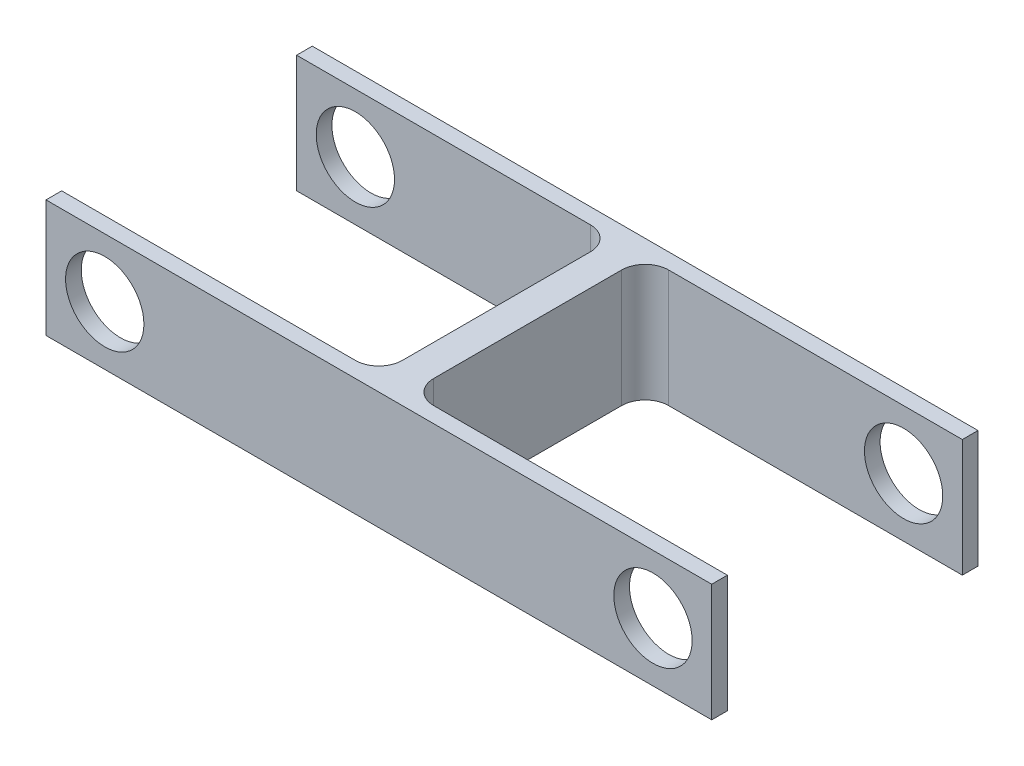
ISO-10303-21;
HEADER;
FILE_DESCRIPTION(('STEP AP214'),'2;1');
FILE_NAME('part.step','',(''),(''),'','','');
FILE_SCHEMA(('AUTOMOTIVE_DESIGN { 1 0 10303 214 1 1 1 1 }'));
ENDSEC;
DATA;
#1=APPLICATION_CONTEXT('core data for automotive mechanical design processes');
#2=APPLICATION_PROTOCOL_DEFINITION('international standard','automotive_design',2000,#1);
#3=PRODUCT_CONTEXT('',#1,'mechanical');
#4=PRODUCT('Part','Part','',(#3));
#5=PRODUCT_RELATED_PRODUCT_CATEGORY('part','',(#4));
#6=PRODUCT_DEFINITION_FORMATION('','',#4);
#7=PRODUCT_DEFINITION_CONTEXT('part definition',#1,'design');
#8=PRODUCT_DEFINITION('design','',#6,#7);
#9=PRODUCT_DEFINITION_SHAPE('','',#8);
#10=(LENGTH_UNIT() NAMED_UNIT(*) SI_UNIT(.MILLI.,.METRE.));
#11=(NAMED_UNIT(*) PLANE_ANGLE_UNIT() SI_UNIT($,.RADIAN.));
#12=(NAMED_UNIT(*) SI_UNIT($,.STERADIAN.) SOLID_ANGLE_UNIT());
#13=UNCERTAINTY_MEASURE_WITH_UNIT(LENGTH_MEASURE(1.E-05),#10,'distance_accuracy_value','');
#14=(GEOMETRIC_REPRESENTATION_CONTEXT(3) GLOBAL_UNCERTAINTY_ASSIGNED_CONTEXT((#13)) GLOBAL_UNIT_ASSIGNED_CONTEXT((#10,
#11,#12)) REPRESENTATION_CONTEXT('',''));
#15=CARTESIAN_POINT('',(0.,0.,0.));
#16=DIRECTION('',(0.,0.,1.));
#17=DIRECTION('',(1.,0.,0.));
#18=AXIS2_PLACEMENT_3D('',#15,#16,#17);
#19=CARTESIAN_POINT('',(0.,0.,0.));
#20=DIRECTION('',(0.,0.,-1.));
#21=DIRECTION('',(-1.,0.,0.));
#22=AXIS2_PLACEMENT_3D('',#19,#20,#21);
#23=PLANE('',#22);
#24=CARTESIAN_POINT('',(88.9,0.,0.));
#25=DIRECTION('',(0.,0.,1.));
#26=DIRECTION('',(1.,0.,0.));
#27=AXIS2_PLACEMENT_3D('',#24,#25,#26);
#28=CIRCLE('',#27,12.7);
#29=CARTESIAN_POINT('',(101.6,0.,0.));
#30=VERTEX_POINT('',#29);
#31=EDGE_CURVE('E217',#30,#30,#28,.T.);
#32=ORIENTED_EDGE('',*,*,#31,.T.);
#33=EDGE_LOOP('',(#32));
#34=FACE_BOUND('',#33,.T.);
#35=DIRECTION('',(1.,0.,0.));
#36=VECTOR('',#35,1.);
#37=CARTESIAN_POINT('',(-107.95,-19.05,0.));
#38=LINE('',#37,#36);
#39=CARTESIAN_POINT('',(12.7,-19.05,0.));
#40=VERTEX_POINT('',#39);
#41=CARTESIAN_POINT('',(107.95,-19.05,0.));
#42=VERTEX_POINT('',#41);
#43=EDGE_CURVE('E271',#40,#42,#38,.T.);
#44=ORIENTED_EDGE('',*,*,#43,.F.);
#45=DIRECTION('',(0.,1.,0.));
#46=VECTOR('',#45,1.);
#47=CARTESIAN_POINT('',(12.7,19.05,0.));
#48=LINE('',#47,#46);
#49=CARTESIAN_POINT('',(12.7,19.05,0.));
#50=VERTEX_POINT('',#49);
#51=EDGE_CURVE('E313',#40,#50,#48,.T.);
#52=ORIENTED_EDGE('',*,*,#51,.T.);
#53=DIRECTION('',(-1.,0.,0.));
#54=VECTOR('',#53,1.);
#55=CARTESIAN_POINT('',(-107.95,19.05,0.));
#56=LINE('',#55,#54);
#57=CARTESIAN_POINT('',(107.95,19.05,0.));
#58=VERTEX_POINT('',#57);
#59=EDGE_CURVE('E264',#58,#50,#56,.T.);
#60=ORIENTED_EDGE('',*,*,#59,.F.);
#61=DIRECTION('',(0.,1.,0.));
#62=VECTOR('',#61,1.);
#63=CARTESIAN_POINT('',(107.95,-19.05,0.));
#64=LINE('',#63,#62);
#65=EDGE_CURVE('E233',#42,#58,#64,.T.);
#66=ORIENTED_EDGE('',*,*,#65,.F.);
#67=EDGE_LOOP('',(#44,#52,#60,#66));
#68=FACE_BOUND('',#67,.T.);
#69=ADVANCED_FACE('F39',(#34,#68),#23,.T.);
#70=CARTESIAN_POINT('',(-88.9,0.,0.));
#71=DIRECTION('',(0.,0.,1.));
#72=DIRECTION('',(1.,0.,0.));
#73=AXIS2_PLACEMENT_3D('',#70,#71,#72);
#74=CIRCLE('',#73,12.7);
#75=CARTESIAN_POINT('',(-76.2,0.,0.));
#76=VERTEX_POINT('',#75);
#77=EDGE_CURVE('E234',#76,#76,#74,.T.);
#78=ORIENTED_EDGE('',*,*,#77,.T.);
#79=EDGE_LOOP('',(#78));
#80=FACE_BOUND('',#79,.T.);
#81=CARTESIAN_POINT('',(-12.7,19.05,0.));
#82=VERTEX_POINT('',#81);
#83=CARTESIAN_POINT('',(-107.95,19.05,0.));
#84=VERTEX_POINT('',#83);
#85=EDGE_CURVE('E263',#82,#84,#56,.T.);
#86=ORIENTED_EDGE('',*,*,#85,.F.);
#87=DIRECTION('',(0.,-1.,0.));
#88=VECTOR('',#87,1.);
#89=CARTESIAN_POINT('',(-12.7,-19.05,0.));
#90=LINE('',#89,#88);
#91=CARTESIAN_POINT('',(-12.7,-19.05,0.));
#92=VERTEX_POINT('',#91);
#93=EDGE_CURVE('E309',#82,#92,#90,.T.);
#94=ORIENTED_EDGE('',*,*,#93,.T.);
#95=CARTESIAN_POINT('',(-107.95,-19.05,0.));
#96=VERTEX_POINT('',#95);
#97=EDGE_CURVE('E250',#96,#92,#38,.T.);
#98=ORIENTED_EDGE('',*,*,#97,.F.);
#99=DIRECTION('',(0.,-1.,0.));
#100=VECTOR('',#99,1.);
#101=CARTESIAN_POINT('',(-107.95,-19.05,0.));
#102=LINE('',#101,#100);
#103=EDGE_CURVE('E268',#84,#96,#102,.T.);
#104=ORIENTED_EDGE('',*,*,#103,.F.);
#105=EDGE_LOOP('',(#86,#94,#98,#104));
#106=FACE_BOUND('',#105,.T.);
#107=ADVANCED_FACE('F357',(#80,#106),#23,.T.);
#108=CARTESIAN_POINT('',(107.95,-19.05,5.08));
#109=DIRECTION('',(-1.,0.,0.));
#110=DIRECTION('',(0.,0.,1.));
#111=AXIS2_PLACEMENT_3D('',#108,#109,#110);
#112=PLANE('',#111);
#113=ORIENTED_EDGE('',*,*,#65,.T.);
#114=DIRECTION('',(0.,0.,-1.));
#115=VECTOR('',#114,1.);
#116=CARTESIAN_POINT('',(107.95,19.05,5.08));
#117=LINE('',#116,#115);
#118=CARTESIAN_POINT('',(107.95,19.05,5.08));
#119=VERTEX_POINT('',#118);
#120=EDGE_CURVE('E285',#119,#58,#117,.T.);
#121=ORIENTED_EDGE('',*,*,#120,.F.);
#122=DIRECTION('',(0.,1.,0.));
#123=VECTOR('',#122,1.);
#124=CARTESIAN_POINT('',(107.95,-19.05,5.08));
#125=LINE('',#124,#123);
#126=CARTESIAN_POINT('',(107.95,-19.05,5.08));
#127=VERTEX_POINT('',#126);
#128=EDGE_CURVE('E245',#127,#119,#125,.T.);
#129=ORIENTED_EDGE('',*,*,#128,.F.);
#130=DIRECTION('',(0.,0.,-1.));
#131=VECTOR('',#130,1.);
#132=CARTESIAN_POINT('',(107.95,-19.05,5.08));
#133=LINE('',#132,#131);
#134=EDGE_CURVE('E259',#127,#42,#133,.T.);
#135=ORIENTED_EDGE('',*,*,#134,.T.);
#136=EDGE_LOOP('',(#113,#121,#129,#135));
#137=FACE_BOUND('',#136,.T.);
#138=ADVANCED_FACE('F365',(#137),#112,.F.);
#139=CARTESIAN_POINT('',(-107.95,19.05,5.08));
#140=DIRECTION('',(0.,-1.,0.));
#141=DIRECTION('',(0.,0.,-1.));
#142=AXIS2_PLACEMENT_3D('',#139,#140,#141);
#143=PLANE('',#142);
#144=ORIENTED_EDGE('',*,*,#59,.T.);
#145=CARTESIAN_POINT('',(12.7,19.05,-7.62));
#146=DIRECTION('',(0.,-1.,0.));
#147=DIRECTION('',(0.,0.,-1.));
#148=AXIS2_PLACEMENT_3D('',#145,#146,#147);
#149=CIRCLE('',#148,7.62);
#150=CARTESIAN_POINT('',(5.08,19.05,-7.62000000000001));
#151=VERTEX_POINT('',#150);
#152=EDGE_CURVE('E48',#50,#151,#149,.T.);
#153=ORIENTED_EDGE('',*,*,#152,.T.);
#154=DIRECTION('',(0.,0.,1.));
#155=VECTOR('',#154,1.);
#156=CARTESIAN_POINT('',(5.08,19.05,-38.1));
#157=LINE('',#156,#155);
#158=CARTESIAN_POINT('',(5.08,19.05,-68.58));
#159=VERTEX_POINT('',#158);
#160=EDGE_CURVE('E163',#159,#151,#157,.T.);
#161=ORIENTED_EDGE('',*,*,#160,.F.);
#162=CARTESIAN_POINT('',(12.7,19.05,-68.58));
#163=DIRECTION('',(0.,-1.,0.));
#164=DIRECTION('',(0.,0.,-1.));
#165=AXIS2_PLACEMENT_3D('',#162,#163,#164);
#166=CIRCLE('',#165,7.62);
#167=CARTESIAN_POINT('',(12.7,19.05,-76.2));
#168=VERTEX_POINT('',#167);
#169=EDGE_CURVE('E316',#159,#168,#166,.T.);
#170=ORIENTED_EDGE('',*,*,#169,.T.);
#171=DIRECTION('',(-1.,0.,0.));
#172=VECTOR('',#171,1.);
#173=CARTESIAN_POINT('',(-107.95,19.05,-76.2));
#174=LINE('',#173,#172);
#175=CARTESIAN_POINT('',(107.95,19.05,-76.2));
#176=VERTEX_POINT('',#175);
#177=EDGE_CURVE('E175',#176,#168,#174,.T.);
#178=ORIENTED_EDGE('',*,*,#177,.F.);
#179=DIRECTION('',(0.,0.,1.));
#180=VECTOR('',#179,1.);
#181=CARTESIAN_POINT('',(107.95,19.05,-81.28));
#182=LINE('',#181,#180);
#183=CARTESIAN_POINT('',(107.95,19.05,-81.28));
#184=VERTEX_POINT('',#183);
#185=EDGE_CURVE('E189',#184,#176,#182,.T.);
#186=ORIENTED_EDGE('',*,*,#185,.F.);
#187=DIRECTION('',(-1.,0.,0.));
#188=VECTOR('',#187,1.);
#189=CARTESIAN_POINT('',(-107.95,19.05,-81.28));
#190=LINE('',#189,#188);
#191=CARTESIAN_POINT('',(-107.95,19.05,-81.28));
#192=VERTEX_POINT('',#191);
#193=EDGE_CURVE('E173',#184,#192,#190,.T.);
#194=ORIENTED_EDGE('',*,*,#193,.T.);
#195=DIRECTION('',(0.,0.,1.));
#196=VECTOR('',#195,1.);
#197=CARTESIAN_POINT('',(-107.95,19.05,-81.28));
#198=LINE('',#197,#196);
#199=CARTESIAN_POINT('',(-107.95,19.05,-76.2));
#200=VERTEX_POINT('',#199);
#201=EDGE_CURVE('E208',#192,#200,#198,.T.);
#202=ORIENTED_EDGE('',*,*,#201,.T.);
#203=CARTESIAN_POINT('',(-12.7,19.05,-76.2));
#204=VERTEX_POINT('',#203);
#205=EDGE_CURVE('E202',#204,#200,#174,.T.);
#206=ORIENTED_EDGE('',*,*,#205,.F.);
#207=CARTESIAN_POINT('',(-12.7,19.05,-68.58));
#208=DIRECTION('',(0.,-1.,0.));
#209=DIRECTION('',(0.,0.,-1.));
#210=AXIS2_PLACEMENT_3D('',#207,#208,#209);
#211=CIRCLE('',#210,7.62);
#212=CARTESIAN_POINT('',(-5.08,19.05,-68.58));
#213=VERTEX_POINT('',#212);
#214=EDGE_CURVE('E325',#204,#213,#211,.T.);
#215=ORIENTED_EDGE('',*,*,#214,.T.);
#216=DIRECTION('',(0.,0.,1.));
#217=VECTOR('',#216,1.);
#218=CARTESIAN_POINT('',(-5.08,19.05,-38.1));
#219=LINE('',#218,#217);
#220=CARTESIAN_POINT('',(-5.08,19.05,-7.62000000000001));
#221=VERTEX_POINT('',#220);
#222=EDGE_CURVE('E222',#213,#221,#219,.T.);
#223=ORIENTED_EDGE('',*,*,#222,.T.);
#224=CARTESIAN_POINT('',(-12.7,19.05,-7.62));
#225=DIRECTION('',(0.,-1.,0.));
#226=DIRECTION('',(0.,0.,-1.));
#227=AXIS2_PLACEMENT_3D('',#224,#225,#226);
#228=CIRCLE('',#227,7.62);
#229=EDGE_CURVE('E331',#221,#82,#228,.T.);
#230=ORIENTED_EDGE('',*,*,#229,.T.);
#231=ORIENTED_EDGE('',*,*,#85,.T.);
#232=DIRECTION('',(0.,0.,-1.));
#233=VECTOR('',#232,1.);
#234=CARTESIAN_POINT('',(-107.95,19.05,5.08));
#235=LINE('',#234,#233);
#236=CARTESIAN_POINT('',(-107.95,19.05,5.08));
#237=VERTEX_POINT('',#236);
#238=EDGE_CURVE('E281',#237,#84,#235,.T.);
#239=ORIENTED_EDGE('',*,*,#238,.F.);
#240=DIRECTION('',(-1.,0.,0.));
#241=VECTOR('',#240,1.);
#242=CARTESIAN_POINT('',(-107.95,19.05,5.08));
#243=LINE('',#242,#241);
#244=EDGE_CURVE('E249',#119,#237,#243,.T.);
#245=ORIENTED_EDGE('',*,*,#244,.F.);
#246=ORIENTED_EDGE('',*,*,#120,.T.);
#247=EDGE_LOOP('',(#144,#153,#161,#170,#178,#186,#194,#202,#206,#215,#223,#230,#231,#239,#245,#246));
#248=FACE_BOUND('',#247,.T.);
#249=ADVANCED_FACE('F336',(#248),#143,.F.);
#250=CARTESIAN_POINT('',(-107.95,-19.05,5.08));
#251=DIRECTION('',(1.,0.,0.));
#252=DIRECTION('',(0.,0.,-1.));
#253=AXIS2_PLACEMENT_3D('',#250,#251,#252);
#254=PLANE('',#253);
#255=ORIENTED_EDGE('',*,*,#103,.T.);
#256=DIRECTION('',(0.,0.,-1.));
#257=VECTOR('',#256,1.);
#258=CARTESIAN_POINT('',(-107.95,-19.05,5.08));
#259=LINE('',#258,#257);
#260=CARTESIAN_POINT('',(-107.95,-19.05,5.08));
#261=VERTEX_POINT('',#260);
#262=EDGE_CURVE('E277',#261,#96,#259,.T.);
#263=ORIENTED_EDGE('',*,*,#262,.F.);
#264=DIRECTION('',(0.,-1.,0.));
#265=VECTOR('',#264,1.);
#266=CARTESIAN_POINT('',(-107.95,-19.05,5.08));
#267=LINE('',#266,#265);
#268=EDGE_CURVE('E253',#237,#261,#267,.T.);
#269=ORIENTED_EDGE('',*,*,#268,.F.);
#270=ORIENTED_EDGE('',*,*,#238,.T.);
#271=EDGE_LOOP('',(#255,#263,#269,#270));
#272=FACE_BOUND('',#271,.T.);
#273=ADVANCED_FACE('F354',(#272),#254,.F.);
#274=CARTESIAN_POINT('',(-107.95,-19.05,5.08));
#275=DIRECTION('',(0.,1.,0.));
#276=DIRECTION('',(0.,0.,1.));
#277=AXIS2_PLACEMENT_3D('',#274,#275,#276);
#278=PLANE('',#277);
#279=ORIENTED_EDGE('',*,*,#97,.T.);
#280=CARTESIAN_POINT('',(-12.7,-19.05,-7.62));
#281=DIRECTION('',(0.,1.,0.));
#282=DIRECTION('',(0.,0.,1.));
#283=AXIS2_PLACEMENT_3D('',#280,#281,#282);
#284=CIRCLE('',#283,7.62);
#285=CARTESIAN_POINT('',(-5.08,-19.05,-7.62000000000001));
#286=VERTEX_POINT('',#285);
#287=EDGE_CURVE('E328',#92,#286,#284,.T.);
#288=ORIENTED_EDGE('',*,*,#287,.T.);
#289=DIRECTION('',(0.,0.,1.));
#290=VECTOR('',#289,1.);
#291=CARTESIAN_POINT('',(-5.08,-19.05,-38.1));
#292=LINE('',#291,#290);
#293=CARTESIAN_POINT('',(-5.08,-19.05,-68.58));
#294=VERTEX_POINT('',#293);
#295=EDGE_CURVE('E218',#294,#286,#292,.T.);
#296=ORIENTED_EDGE('',*,*,#295,.F.);
#297=CARTESIAN_POINT('',(-12.7,-19.05,-68.58));
#298=DIRECTION('',(0.,1.,0.));
#299=DIRECTION('',(0.,0.,1.));
#300=AXIS2_PLACEMENT_3D('',#297,#298,#299);
#301=CIRCLE('',#300,7.62);
#302=CARTESIAN_POINT('',(-12.7,-19.05,-76.2));
#303=VERTEX_POINT('',#302);
#304=EDGE_CURVE('E322',#294,#303,#301,.T.);
#305=ORIENTED_EDGE('',*,*,#304,.T.);
#306=DIRECTION('',(1.,0.,0.));
#307=VECTOR('',#306,1.);
#308=CARTESIAN_POINT('',(-107.95,-19.05,-76.2));
#309=LINE('',#308,#307);
#310=CARTESIAN_POINT('',(-107.95,-19.05,-76.2));
#311=VERTEX_POINT('',#310);
#312=EDGE_CURVE('E194',#311,#303,#309,.T.);
#313=ORIENTED_EDGE('',*,*,#312,.F.);
#314=DIRECTION('',(0.,0.,1.));
#315=VECTOR('',#314,1.);
#316=CARTESIAN_POINT('',(-107.95,-19.05,-81.28));
#317=LINE('',#316,#315);
#318=CARTESIAN_POINT('',(-107.95,-19.05,-81.28));
#319=VERTEX_POINT('',#318);
#320=EDGE_CURVE('E164',#319,#311,#317,.T.);
#321=ORIENTED_EDGE('',*,*,#320,.F.);
#322=DIRECTION('',(1.,0.,0.));
#323=VECTOR('',#322,1.);
#324=CARTESIAN_POINT('',(-107.95,-19.05,-81.28));
#325=LINE('',#324,#323);
#326=CARTESIAN_POINT('',(107.95,-19.05,-81.28));
#327=VERTEX_POINT('',#326);
#328=EDGE_CURVE('E170',#319,#327,#325,.T.);
#329=ORIENTED_EDGE('',*,*,#328,.T.);
#330=DIRECTION('',(0.,0.,1.));
#331=VECTOR('',#330,1.);
#332=CARTESIAN_POINT('',(107.95,-19.05,-81.28));
#333=LINE('',#332,#331);
#334=CARTESIAN_POINT('',(107.95,-19.05,-76.2));
#335=VERTEX_POINT('',#334);
#336=EDGE_CURVE('E153',#327,#335,#333,.T.);
#337=ORIENTED_EDGE('',*,*,#336,.T.);
#338=CARTESIAN_POINT('',(12.7,-19.05,-76.2));
#339=VERTEX_POINT('',#338);
#340=EDGE_CURVE('E192',#339,#335,#309,.T.);
#341=ORIENTED_EDGE('',*,*,#340,.F.);
#342=CARTESIAN_POINT('',(12.7,-19.05,-68.58));
#343=DIRECTION('',(0.,1.,0.));
#344=DIRECTION('',(0.,0.,1.));
#345=AXIS2_PLACEMENT_3D('',#342,#343,#344);
#346=CIRCLE('',#345,7.62);
#347=CARTESIAN_POINT('',(5.08,-19.05,-68.58));
#348=VERTEX_POINT('',#347);
#349=EDGE_CURVE('E319',#339,#348,#346,.T.);
#350=ORIENTED_EDGE('',*,*,#349,.T.);
#351=DIRECTION('',(0.,0.,1.));
#352=VECTOR('',#351,1.);
#353=CARTESIAN_POINT('',(5.08,-19.05,-38.1));
#354=LINE('',#353,#352);
#355=CARTESIAN_POINT('',(5.08,-19.05,-7.62000000000001));
#356=VERTEX_POINT('',#355);
#357=EDGE_CURVE('E214',#348,#356,#354,.T.);
#358=ORIENTED_EDGE('',*,*,#357,.T.);
#359=CARTESIAN_POINT('',(12.7,-19.05,-7.62));
#360=DIRECTION('',(0.,1.,0.));
#361=DIRECTION('',(0.,0.,1.));
#362=AXIS2_PLACEMENT_3D('',#359,#360,#361);
#363=CIRCLE('',#362,7.62);
#364=EDGE_CURVE('E11',#356,#40,#363,.T.);
#365=ORIENTED_EDGE('',*,*,#364,.T.);
#366=ORIENTED_EDGE('',*,*,#43,.T.);
#367=ORIENTED_EDGE('',*,*,#134,.F.);
#368=DIRECTION('',(1.,0.,0.));
#369=VECTOR('',#368,1.);
#370=CARTESIAN_POINT('',(-107.95,-19.05,5.08));
#371=LINE('',#370,#369);
#372=EDGE_CURVE('E256',#261,#127,#371,.T.);
#373=ORIENTED_EDGE('',*,*,#372,.F.);
#374=ORIENTED_EDGE('',*,*,#262,.T.);
#375=EDGE_LOOP('',(#279,#288,#296,#305,#313,#321,#329,#337,#341,#350,#358,#365,#366,#367,#373,#374));
#376=FACE_BOUND('',#375,.T.);
#377=ADVANCED_FACE('F178',(#376),#278,.F.);
#378=CARTESIAN_POINT('',(0.,0.,5.08));
#379=DIRECTION('',(0.,0.,-1.));
#380=DIRECTION('',(-1.,0.,0.));
#381=AXIS2_PLACEMENT_3D('',#378,#379,#380);
#382=PLANE('',#381);
#383=CARTESIAN_POINT('',(-88.9,0.,5.08));
#384=DIRECTION('',(0.,0.,1.));
#385=DIRECTION('',(1.,0.,0.));
#386=AXIS2_PLACEMENT_3D('',#383,#384,#385);
#387=CIRCLE('',#386,12.7);
#388=CARTESIAN_POINT('',(-76.2,0.,5.08));
#389=VERTEX_POINT('',#388);
#390=EDGE_CURVE('E229',#389,#389,#387,.T.);
#391=ORIENTED_EDGE('',*,*,#390,.F.);
#392=EDGE_LOOP('',(#391));
#393=FACE_BOUND('',#392,.T.);
#394=CARTESIAN_POINT('',(88.9,0.,5.08));
#395=DIRECTION('',(0.,0.,1.));
#396=DIRECTION('',(1.,0.,0.));
#397=AXIS2_PLACEMENT_3D('',#394,#395,#396);
#398=CIRCLE('',#397,12.7);
#399=CARTESIAN_POINT('',(101.6,0.,5.08));
#400=VERTEX_POINT('',#399);
#401=EDGE_CURVE('E238',#400,#400,#398,.T.);
#402=ORIENTED_EDGE('',*,*,#401,.F.);
#403=EDGE_LOOP('',(#402));
#404=FACE_BOUND('',#403,.T.);
#405=ORIENTED_EDGE('',*,*,#128,.T.);
#406=ORIENTED_EDGE('',*,*,#244,.T.);
#407=ORIENTED_EDGE('',*,*,#268,.T.);
#408=ORIENTED_EDGE('',*,*,#372,.T.);
#409=EDGE_LOOP('',(#405,#406,#407,#408));
#410=FACE_BOUND('',#409,.T.);
#411=ADVANCED_FACE('F362',(#393,#404,#410),#382,.F.);
#412=CARTESIAN_POINT('',(88.9,0.,5.08));
#413=DIRECTION('',(0.,0.,-1.));
#414=DIRECTION('',(-1.,0.,0.));
#415=AXIS2_PLACEMENT_3D('',#412,#413,#414);
#416=CYLINDRICAL_SURFACE('',#415,12.7);
#417=ORIENTED_EDGE('',*,*,#401,.T.);
#418=EDGE_LOOP('',(#417));
#419=FACE_BOUND('',#418,.T.);
#420=ORIENTED_EDGE('',*,*,#31,.F.);
#421=EDGE_LOOP('',(#420));
#422=FACE_BOUND('',#421,.T.);
#423=ADVANCED_FACE('F396',(#419,#422),#416,.F.);
#424=CARTESIAN_POINT('',(-88.9,0.,5.08));
#425=DIRECTION('',(0.,0.,-1.));
#426=DIRECTION('',(-1.,0.,0.));
#427=AXIS2_PLACEMENT_3D('',#424,#425,#426);
#428=CYLINDRICAL_SURFACE('',#427,12.7);
#429=ORIENTED_EDGE('',*,*,#390,.T.);
#430=EDGE_LOOP('',(#429));
#431=FACE_BOUND('',#430,.T.);
#432=ORIENTED_EDGE('',*,*,#77,.F.);
#433=EDGE_LOOP('',(#432));
#434=FACE_BOUND('',#433,.T.);
#435=ADVANCED_FACE('F403',(#431,#434),#428,.F.);
#436=CARTESIAN_POINT('',(5.08,-19.05,-38.1));
#437=DIRECTION('',(1.,0.,0.));
#438=DIRECTION('',(0.,0.,-1.));
#439=AXIS2_PLACEMENT_3D('',#436,#437,#438);
#440=PLANE('',#439);
#441=ORIENTED_EDGE('',*,*,#357,.F.);
#442=DIRECTION('',(0.,1.,0.));
#443=VECTOR('',#442,1.);
#444=CARTESIAN_POINT('',(5.08,19.05,-68.58));
#445=LINE('',#444,#443);
#446=EDGE_CURVE('E292',#348,#159,#445,.T.);
#447=ORIENTED_EDGE('',*,*,#446,.T.);
#448=ORIENTED_EDGE('',*,*,#160,.T.);
#449=DIRECTION('',(0.,1.,0.));
#450=VECTOR('',#449,1.);
#451=CARTESIAN_POINT('',(5.08,-19.05,-7.62));
#452=LINE('',#451,#450);
#453=EDGE_CURVE('E289',#151,#356,#452,.F.);
#454=ORIENTED_EDGE('',*,*,#453,.T.);
#455=EDGE_LOOP('',(#441,#447,#448,#454));
#456=FACE_BOUND('',#455,.T.);
#457=ADVANCED_FACE('F339',(#456),#440,.T.);
#458=CARTESIAN_POINT('',(-5.08,-19.05,-38.1));
#459=DIRECTION('',(-1.,0.,0.));
#460=DIRECTION('',(0.,0.,1.));
#461=AXIS2_PLACEMENT_3D('',#458,#459,#460);
#462=PLANE('',#461);
#463=ORIENTED_EDGE('',*,*,#222,.F.);
#464=DIRECTION('',(0.,-1.,0.));
#465=VECTOR('',#464,1.);
#466=CARTESIAN_POINT('',(-5.08,-19.05,-68.58));
#467=LINE('',#466,#465);
#468=EDGE_CURVE('E302',#213,#294,#467,.T.);
#469=ORIENTED_EDGE('',*,*,#468,.T.);
#470=ORIENTED_EDGE('',*,*,#295,.T.);
#471=DIRECTION('',(0.,-1.,0.));
#472=VECTOR('',#471,1.);
#473=CARTESIAN_POINT('',(-5.08,19.05,-7.62));
#474=LINE('',#473,#472);
#475=EDGE_CURVE('E299',#286,#221,#474,.F.);
#476=ORIENTED_EDGE('',*,*,#475,.T.);
#477=EDGE_LOOP('',(#463,#469,#470,#476));
#478=FACE_BOUND('',#477,.T.);
#479=ADVANCED_FACE('F419',(#478),#462,.T.);
#480=CARTESIAN_POINT('',(0.,0.,-76.2));
#481=DIRECTION('',(0.,0.,1.));
#482=DIRECTION('',(-1.,0.,0.));
#483=AXIS2_PLACEMENT_3D('',#480,#481,#482);
#484=PLANE('',#483);
#485=CARTESIAN_POINT('',(88.9,0.,-76.2));
#486=DIRECTION('',(0.,0.,1.));
#487=DIRECTION('',(1.,0.,0.));
#488=AXIS2_PLACEMENT_3D('',#485,#486,#487);
#489=CIRCLE('',#488,12.7);
#490=CARTESIAN_POINT('',(101.6,0.,-76.2));
#491=VERTEX_POINT('',#490);
#492=EDGE_CURVE('E612',#491,#491,#489,.T.);
#493=ORIENTED_EDGE('',*,*,#492,.F.);
#494=EDGE_LOOP('',(#493));
#495=FACE_BOUND('',#494,.T.);
#496=ORIENTED_EDGE('',*,*,#177,.T.);
#497=DIRECTION('',(0.,1.,0.));
#498=VECTOR('',#497,1.);
#499=CARTESIAN_POINT('',(12.7,-19.05,-76.2));
#500=LINE('',#499,#498);
#501=EDGE_CURVE('E296',#168,#339,#500,.F.);
#502=ORIENTED_EDGE('',*,*,#501,.T.);
#503=ORIENTED_EDGE('',*,*,#340,.T.);
#504=DIRECTION('',(0.,1.,0.));
#505=VECTOR('',#504,1.);
#506=CARTESIAN_POINT('',(107.95,-19.05,-76.2));
#507=LINE('',#506,#505);
#508=EDGE_CURVE('E159',#335,#176,#507,.T.);
#509=ORIENTED_EDGE('',*,*,#508,.T.);
#510=EDGE_LOOP('',(#496,#502,#503,#509));
#511=FACE_BOUND('',#510,.T.);
#512=ADVANCED_FACE('F430',(#495,#511),#484,.T.);
#513=CARTESIAN_POINT('',(-88.9,0.,-76.2));
#514=DIRECTION('',(0.,0.,1.));
#515=DIRECTION('',(1.,0.,0.));
#516=AXIS2_PLACEMENT_3D('',#513,#514,#515);
#517=CIRCLE('',#516,12.7);
#518=CARTESIAN_POINT('',(-76.2,0.,-76.2));
#519=VERTEX_POINT('',#518);
#520=EDGE_CURVE('E604',#519,#519,#517,.T.);
#521=ORIENTED_EDGE('',*,*,#520,.F.);
#522=EDGE_LOOP('',(#521));
#523=FACE_BOUND('',#522,.T.);
#524=ORIENTED_EDGE('',*,*,#312,.T.);
#525=DIRECTION('',(0.,-1.,0.));
#526=VECTOR('',#525,1.);
#527=CARTESIAN_POINT('',(-12.7,19.05,-76.2));
#528=LINE('',#527,#526);
#529=EDGE_CURVE('E306',#303,#204,#528,.F.);
#530=ORIENTED_EDGE('',*,*,#529,.T.);
#531=ORIENTED_EDGE('',*,*,#205,.T.);
#532=DIRECTION('',(0.,-1.,0.));
#533=VECTOR('',#532,1.);
#534=CARTESIAN_POINT('',(-107.95,-19.05,-76.2));
#535=LINE('',#534,#533);
#536=EDGE_CURVE('E198',#200,#311,#535,.T.);
#537=ORIENTED_EDGE('',*,*,#536,.T.);
#538=EDGE_LOOP('',(#524,#530,#531,#537));
#539=FACE_BOUND('',#538,.T.);
#540=ADVANCED_FACE('F448',(#523,#539),#484,.T.);
#541=CARTESIAN_POINT('',(107.95,-19.05,-81.28));
#542=DIRECTION('',(1.,0.,0.));
#543=DIRECTION('',(0.,0.,-1.));
#544=AXIS2_PLACEMENT_3D('',#541,#542,#543);
#545=PLANE('',#544);
#546=ORIENTED_EDGE('',*,*,#508,.F.);
#547=ORIENTED_EDGE('',*,*,#336,.F.);
#548=DIRECTION('',(0.,1.,0.));
#549=VECTOR('',#548,1.);
#550=CARTESIAN_POINT('',(107.95,-19.05,-81.28));
#551=LINE('',#550,#549);
#552=EDGE_CURVE('E156',#327,#184,#551,.T.);
#553=ORIENTED_EDGE('',*,*,#552,.T.);
#554=ORIENTED_EDGE('',*,*,#185,.T.);
#555=EDGE_LOOP('',(#546,#547,#553,#554));
#556=FACE_BOUND('',#555,.T.);
#557=ADVANCED_FACE('F155',(#556),#545,.T.);
#558=CARTESIAN_POINT('',(-107.95,-19.05,-81.28));
#559=DIRECTION('',(-1.,0.,0.));
#560=DIRECTION('',(0.,0.,1.));
#561=AXIS2_PLACEMENT_3D('',#558,#559,#560);
#562=PLANE('',#561);
#563=ORIENTED_EDGE('',*,*,#536,.F.);
#564=ORIENTED_EDGE('',*,*,#201,.F.);
#565=DIRECTION('',(0.,-1.,0.));
#566=VECTOR('',#565,1.);
#567=CARTESIAN_POINT('',(-107.95,-19.05,-81.28));
#568=LINE('',#567,#566);
#569=EDGE_CURVE('E181',#192,#319,#568,.T.);
#570=ORIENTED_EDGE('',*,*,#569,.T.);
#571=ORIENTED_EDGE('',*,*,#320,.T.);
#572=EDGE_LOOP('',(#563,#564,#570,#571));
#573=FACE_BOUND('',#572,.T.);
#574=ADVANCED_FACE('F462',(#573),#562,.T.);
#575=CARTESIAN_POINT('',(0.,0.,-81.28));
#576=DIRECTION('',(0.,0.,1.));
#577=DIRECTION('',(-1.,0.,0.));
#578=AXIS2_PLACEMENT_3D('',#575,#576,#577);
#579=PLANE('',#578);
#580=CARTESIAN_POINT('',(-88.9,0.,-81.28));
#581=DIRECTION('',(0.,0.,1.));
#582=DIRECTION('',(1.,0.,0.));
#583=AXIS2_PLACEMENT_3D('',#580,#581,#582);
#584=CIRCLE('',#583,12.7);
#585=CARTESIAN_POINT('',(-76.2,0.,-81.28));
#586=VERTEX_POINT('',#585);
#587=EDGE_CURVE('E193',#586,#586,#584,.T.);
#588=ORIENTED_EDGE('',*,*,#587,.T.);
#589=EDGE_LOOP('',(#588));
#590=FACE_BOUND('',#589,.T.);
#591=CARTESIAN_POINT('',(88.9,0.,-81.28));
#592=DIRECTION('',(0.,0.,1.));
#593=DIRECTION('',(1.,0.,0.));
#594=AXIS2_PLACEMENT_3D('',#591,#592,#593);
#595=CIRCLE('',#594,12.7);
#596=CARTESIAN_POINT('',(101.6,0.,-81.28));
#597=VERTEX_POINT('',#596);
#598=EDGE_CURVE('E608',#597,#597,#595,.T.);
#599=ORIENTED_EDGE('',*,*,#598,.T.);
#600=EDGE_LOOP('',(#599));
#601=FACE_BOUND('',#600,.T.);
#602=ORIENTED_EDGE('',*,*,#552,.F.);
#603=ORIENTED_EDGE('',*,*,#328,.F.);
#604=ORIENTED_EDGE('',*,*,#569,.F.);
#605=ORIENTED_EDGE('',*,*,#193,.F.);
#606=EDGE_LOOP('',(#602,#603,#604,#605));
#607=FACE_BOUND('',#606,.T.);
#608=ADVANCED_FACE('F168',(#590,#601,#607),#579,.F.);
#609=CARTESIAN_POINT('',(88.9,0.,-81.28));
#610=DIRECTION('',(0.,0.,1.));
#611=DIRECTION('',(1.,0.,0.));
#612=AXIS2_PLACEMENT_3D('',#609,#610,#611);
#613=CYLINDRICAL_SURFACE('',#612,12.7);
#614=ORIENTED_EDGE('',*,*,#598,.F.);
#615=EDGE_LOOP('',(#614));
#616=FACE_BOUND('',#615,.T.);
#617=ORIENTED_EDGE('',*,*,#492,.T.);
#618=EDGE_LOOP('',(#617));
#619=FACE_BOUND('',#618,.T.);
#620=ADVANCED_FACE('F476',(#616,#619),#613,.F.);
#621=CARTESIAN_POINT('',(-88.9,0.,-81.28));
#622=DIRECTION('',(0.,0.,1.));
#623=DIRECTION('',(1.,0.,0.));
#624=AXIS2_PLACEMENT_3D('',#621,#622,#623);
#625=CYLINDRICAL_SURFACE('',#624,12.7);
#626=ORIENTED_EDGE('',*,*,#587,.F.);
#627=EDGE_LOOP('',(#626));
#628=FACE_BOUND('',#627,.T.);
#629=ORIENTED_EDGE('',*,*,#520,.T.);
#630=EDGE_LOOP('',(#629));
#631=FACE_BOUND('',#630,.T.);
#632=ADVANCED_FACE('F484',(#628,#631),#625,.F.);
#633=CARTESIAN_POINT('',(12.7,-19.05,-68.58));
#634=DIRECTION('',(0.,-1.,0.));
#635=DIRECTION('',(0.,0.,-1.));
#636=AXIS2_PLACEMENT_3D('',#633,#634,#635);
#637=CYLINDRICAL_SURFACE('',#636,7.62);
#638=ORIENTED_EDGE('',*,*,#349,.F.);
#639=ORIENTED_EDGE('',*,*,#501,.F.);
#640=ORIENTED_EDGE('',*,*,#169,.F.);
#641=ORIENTED_EDGE('',*,*,#446,.F.);
#642=EDGE_LOOP('',(#638,#639,#640,#641));
#643=FACE_BOUND('',#642,.T.);
#644=ADVANCED_FACE('F491',(#643),#637,.F.);
#645=CARTESIAN_POINT('',(-12.7,-19.05,-68.58));
#646=DIRECTION('',(0.,1.,0.));
#647=DIRECTION('',(0.,0.,1.));
#648=AXIS2_PLACEMENT_3D('',#645,#646,#647);
#649=CYLINDRICAL_SURFACE('',#648,7.62);
#650=ORIENTED_EDGE('',*,*,#214,.F.);
#651=ORIENTED_EDGE('',*,*,#529,.F.);
#652=ORIENTED_EDGE('',*,*,#304,.F.);
#653=ORIENTED_EDGE('',*,*,#468,.F.);
#654=EDGE_LOOP('',(#650,#651,#652,#653));
#655=FACE_BOUND('',#654,.T.);
#656=ADVANCED_FACE('F498',(#655),#649,.F.);
#657=CARTESIAN_POINT('',(-12.7,0.,-7.62));
#658=DIRECTION('',(0.,1.,0.));
#659=DIRECTION('',(0.,0.,1.));
#660=AXIS2_PLACEMENT_3D('',#657,#658,#659);
#661=CYLINDRICAL_SURFACE('',#660,7.62);
#662=ORIENTED_EDGE('',*,*,#229,.F.);
#663=ORIENTED_EDGE('',*,*,#475,.F.);
#664=ORIENTED_EDGE('',*,*,#287,.F.);
#665=ORIENTED_EDGE('',*,*,#93,.F.);
#666=EDGE_LOOP('',(#662,#663,#664,#665));
#667=FACE_BOUND('',#666,.T.);
#668=ADVANCED_FACE('F505',(#667),#661,.F.);
#669=CARTESIAN_POINT('',(12.7,0.,-7.62));
#670=DIRECTION('',(0.,-1.,0.));
#671=DIRECTION('',(0.,0.,-1.));
#672=AXIS2_PLACEMENT_3D('',#669,#670,#671);
#673=CYLINDRICAL_SURFACE('',#672,7.62);
#674=ORIENTED_EDGE('',*,*,#364,.F.);
#675=ORIENTED_EDGE('',*,*,#453,.F.);
#676=ORIENTED_EDGE('',*,*,#152,.F.);
#677=ORIENTED_EDGE('',*,*,#51,.F.);
#678=EDGE_LOOP('',(#674,#675,#676,#677));
#679=FACE_BOUND('',#678,.T.);
#680=ADVANCED_FACE('F41',(#679),#673,.F.);
#681=CLOSED_SHELL('',(#69,#107,#138,#249,#273,#377,#411,#423,#435,#457,#479,#512,#540,#557,#574,
#608,#620,#632,#644,#656,#668,#680));
#682=MANIFOLD_SOLID_BREP('B2',#681);
#683=ADVANCED_BREP_SHAPE_REPRESENTATION('',(#18,#682),#14);
#684=SHAPE_DEFINITION_REPRESENTATION(#9,#683);
ENDSEC;
END-ISO-10303-21;
